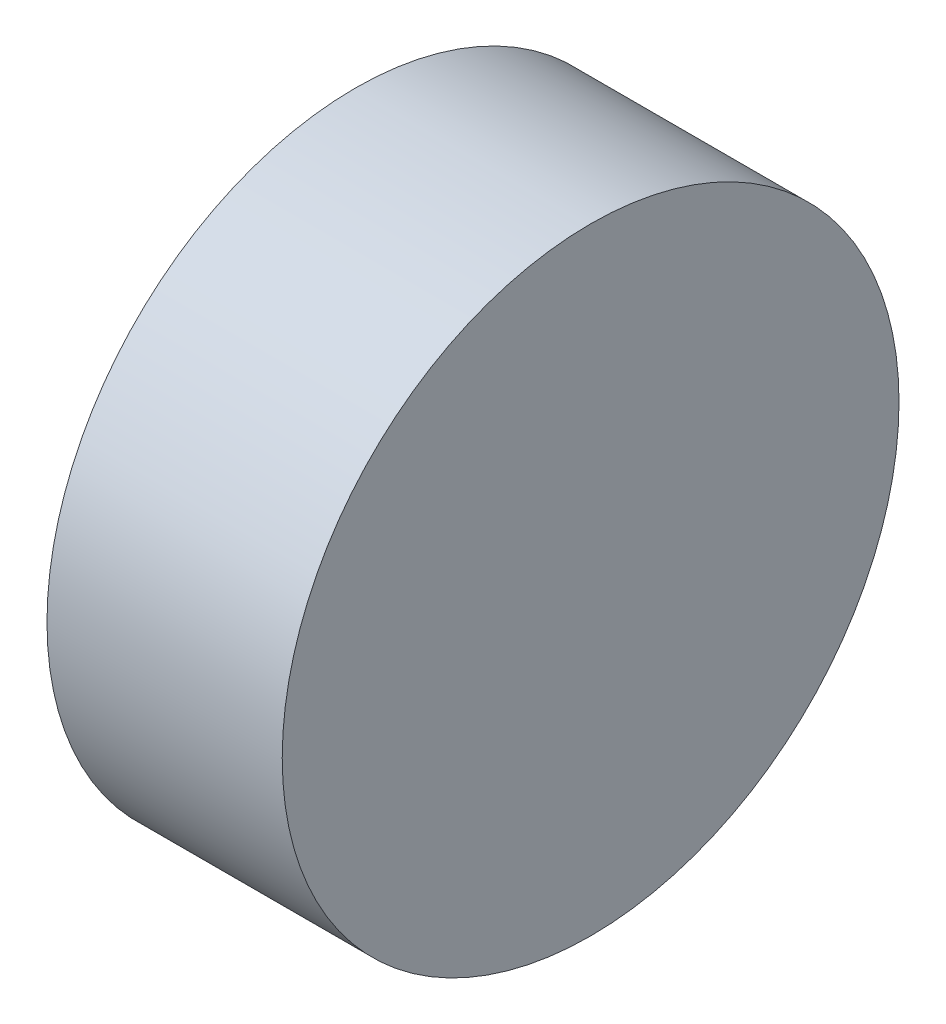
ISO-10303-21;
HEADER;
FILE_DESCRIPTION(('STEP AP214'),'2;1');
FILE_NAME('part.step','',(''),(''),'','','');
FILE_SCHEMA(('AUTOMOTIVE_DESIGN { 1 0 10303 214 1 1 1 1 }'));
ENDSEC;
DATA;
#1=APPLICATION_CONTEXT('core data for automotive mechanical design processes');
#2=APPLICATION_PROTOCOL_DEFINITION('international standard','automotive_design',2000,#1);
#3=PRODUCT_CONTEXT('',#1,'mechanical');
#4=PRODUCT('Part','Part','',(#3));
#5=PRODUCT_RELATED_PRODUCT_CATEGORY('part','',(#4));
#6=PRODUCT_DEFINITION_FORMATION('','',#4);
#7=PRODUCT_DEFINITION_CONTEXT('part definition',#1,'design');
#8=PRODUCT_DEFINITION('design','',#6,#7);
#9=PRODUCT_DEFINITION_SHAPE('','',#8);
#10=(LENGTH_UNIT() NAMED_UNIT(*) SI_UNIT(.MILLI.,.METRE.));
#11=(NAMED_UNIT(*) PLANE_ANGLE_UNIT() SI_UNIT($,.RADIAN.));
#12=(NAMED_UNIT(*) SI_UNIT($,.STERADIAN.) SOLID_ANGLE_UNIT());
#13=UNCERTAINTY_MEASURE_WITH_UNIT(LENGTH_MEASURE(1.E-05),#10,'distance_accuracy_value','');
#14=(GEOMETRIC_REPRESENTATION_CONTEXT(3) GLOBAL_UNCERTAINTY_ASSIGNED_CONTEXT((#13)) GLOBAL_UNIT_ASSIGNED_CONTEXT((#10,
#11,#12)) REPRESENTATION_CONTEXT('',''));
#15=CARTESIAN_POINT('',(0.,0.,0.));
#16=DIRECTION('',(0.,0.,1.));
#17=DIRECTION('',(1.,0.,0.));
#18=AXIS2_PLACEMENT_3D('',#15,#16,#17);
#19=CARTESIAN_POINT('',(-12.7,0.,0.));
#20=DIRECTION('',(1.,0.,0.));
#21=DIRECTION('',(0.,0.,-1.));
#22=AXIS2_PLACEMENT_3D('',#19,#20,#21);
#23=CYLINDRICAL_SURFACE('',#22,33.3);
#24=CARTESIAN_POINT('',(-12.7,0.,0.));
#25=DIRECTION('',(1.,0.,0.));
#26=DIRECTION('',(0.,0.,-1.));
#27=AXIS2_PLACEMENT_3D('',#24,#25,#26);
#28=CIRCLE('',#27,33.3);
#29=CARTESIAN_POINT('',(-12.7,0.,-33.3));
#30=VERTEX_POINT('',#29);
#31=EDGE_CURVE('E10',#30,#30,#28,.T.);
#32=ORIENTED_EDGE('',*,*,#31,.T.);
#33=EDGE_LOOP('',(#32));
#34=FACE_BOUND('',#33,.T.);
#35=CARTESIAN_POINT('',(12.7,0.,0.));
#36=DIRECTION('',(1.,0.,0.));
#37=DIRECTION('',(0.,0.,-1.));
#38=AXIS2_PLACEMENT_3D('',#35,#36,#37);
#39=CIRCLE('',#38,33.3);
#40=CARTESIAN_POINT('',(12.7,0.,-33.3));
#41=VERTEX_POINT('',#40);
#42=EDGE_CURVE('E37',#41,#41,#39,.T.);
#43=ORIENTED_EDGE('',*,*,#42,.F.);
#44=EDGE_LOOP('',(#43));
#45=FACE_BOUND('',#44,.T.);
#46=ADVANCED_FACE('F31',(#34,#45),#23,.T.);
#47=CARTESIAN_POINT('',(-12.7,0.,0.));
#48=DIRECTION('',(1.,0.,0.));
#49=DIRECTION('',(0.,0.,-1.));
#50=AXIS2_PLACEMENT_3D('',#47,#48,#49);
#51=PLANE('',#50);
#52=ORIENTED_EDGE('',*,*,#31,.F.);
#53=EDGE_LOOP('',(#52));
#54=FACE_BOUND('',#53,.T.);
#55=ADVANCED_FACE('F46',(#54),#51,.F.);
#56=CARTESIAN_POINT('',(12.7,0.,0.));
#57=DIRECTION('',(1.,0.,0.));
#58=DIRECTION('',(0.,0.,-1.));
#59=AXIS2_PLACEMENT_3D('',#56,#57,#58);
#60=PLANE('',#59);
#61=ORIENTED_EDGE('',*,*,#42,.T.);
#62=EDGE_LOOP('',(#61));
#63=FACE_BOUND('',#62,.T.);
#64=ADVANCED_FACE('F43',(#63),#60,.T.);
#65=CLOSED_SHELL('',(#46,#55,#64));
#66=MANIFOLD_SOLID_BREP('B2',#65);
#67=ADVANCED_BREP_SHAPE_REPRESENTATION('',(#18,#66),#14);
#68=SHAPE_DEFINITION_REPRESENTATION(#9,#67);
ENDSEC;
END-ISO-10303-21;
